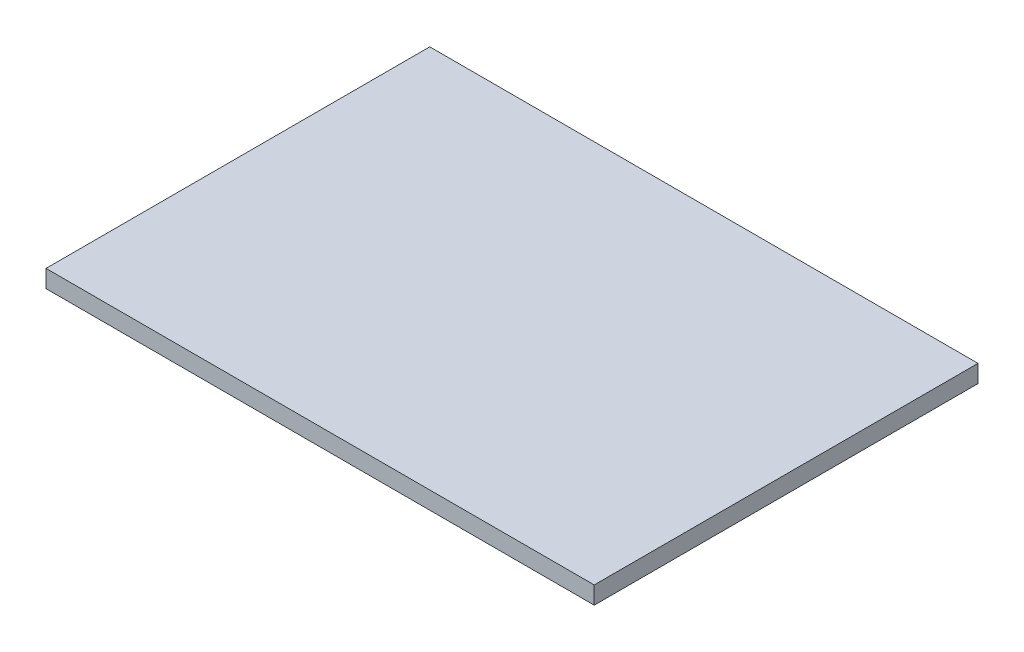
ISO-10303-21;
HEADER;
FILE_DESCRIPTION(('STEP AP214'),'2;1');
FILE_NAME('part.step','',(''),(''),'','','');
FILE_SCHEMA(('AUTOMOTIVE_DESIGN { 1 0 10303 214 1 1 1 1 }'));
ENDSEC;
DATA;
#1=APPLICATION_CONTEXT('core data for automotive mechanical design processes');
#2=APPLICATION_PROTOCOL_DEFINITION('international standard','automotive_design',2000,#1);
#3=PRODUCT_CONTEXT('',#1,'mechanical');
#4=PRODUCT('Part','Part','',(#3));
#5=PRODUCT_RELATED_PRODUCT_CATEGORY('part','',(#4));
#6=PRODUCT_DEFINITION_FORMATION('','',#4);
#7=PRODUCT_DEFINITION_CONTEXT('part definition',#1,'design');
#8=PRODUCT_DEFINITION('design','',#6,#7);
#9=PRODUCT_DEFINITION_SHAPE('','',#8);
#10=(LENGTH_UNIT() NAMED_UNIT(*) SI_UNIT(.MILLI.,.METRE.));
#11=(NAMED_UNIT(*) PLANE_ANGLE_UNIT() SI_UNIT($,.RADIAN.));
#12=(NAMED_UNIT(*) SI_UNIT($,.STERADIAN.) SOLID_ANGLE_UNIT());
#13=UNCERTAINTY_MEASURE_WITH_UNIT(LENGTH_MEASURE(1.E-05),#10,'distance_accuracy_value','');
#14=(GEOMETRIC_REPRESENTATION_CONTEXT(3) GLOBAL_UNCERTAINTY_ASSIGNED_CONTEXT((#13)) GLOBAL_UNIT_ASSIGNED_CONTEXT((#10,
#11,#12)) REPRESENTATION_CONTEXT('',''));
#15=CARTESIAN_POINT('',(0.,0.,0.));
#16=DIRECTION('',(0.,0.,1.));
#17=DIRECTION('',(1.,0.,0.));
#18=AXIS2_PLACEMENT_3D('',#15,#16,#17);
#19=CARTESIAN_POINT('',(-125.,8.,87.5));
#20=DIRECTION('',(1.,0.,0.));
#21=DIRECTION('',(0.,0.,-1.));
#22=AXIS2_PLACEMENT_3D('',#19,#20,#21);
#23=PLANE('',#22);
#24=DIRECTION('',(0.,0.,1.));
#25=VECTOR('',#24,1.);
#26=CARTESIAN_POINT('',(-125.,0.,87.5));
#27=LINE('',#26,#25);
#28=CARTESIAN_POINT('',(-125.,0.,-87.5));
#29=VERTEX_POINT('',#28);
#30=CARTESIAN_POINT('',(-125.,0.,87.5));
#31=VERTEX_POINT('',#30);
#32=EDGE_CURVE('E99',#29,#31,#27,.T.);
#33=ORIENTED_EDGE('',*,*,#32,.T.);
#34=DIRECTION('',(0.,-1.,0.));
#35=VECTOR('',#34,1.);
#36=CARTESIAN_POINT('',(-125.,8.,87.5));
#37=LINE('',#36,#35);
#38=CARTESIAN_POINT('',(-125.,8.,87.5));
#39=VERTEX_POINT('',#38);
#40=EDGE_CURVE('E11',#39,#31,#37,.T.);
#41=ORIENTED_EDGE('',*,*,#40,.F.);
#42=DIRECTION('',(0.,0.,1.));
#43=VECTOR('',#42,1.);
#44=CARTESIAN_POINT('',(-125.,8.,87.5));
#45=LINE('',#44,#43);
#46=CARTESIAN_POINT('',(-125.,8.,-87.5));
#47=VERTEX_POINT('',#46);
#48=EDGE_CURVE('E87',#47,#39,#45,.T.);
#49=ORIENTED_EDGE('',*,*,#48,.F.);
#50=DIRECTION('',(0.,-1.,0.));
#51=VECTOR('',#50,1.);
#52=CARTESIAN_POINT('',(-125.,8.,-87.5));
#53=LINE('',#52,#51);
#54=EDGE_CURVE('E95',#47,#29,#53,.T.);
#55=ORIENTED_EDGE('',*,*,#54,.T.);
#56=EDGE_LOOP('',(#33,#41,#49,#55));
#57=FACE_BOUND('',#56,.T.);
#58=ADVANCED_FACE('F36',(#57),#23,.F.);
#59=CARTESIAN_POINT('',(-125.,8.,87.5));
#60=DIRECTION('',(0.,0.,-1.));
#61=DIRECTION('',(-1.,0.,0.));
#62=AXIS2_PLACEMENT_3D('',#59,#60,#61);
#63=PLANE('',#62);
#64=DIRECTION('',(1.,0.,0.));
#65=VECTOR('',#64,1.);
#66=CARTESIAN_POINT('',(-125.,0.,87.5));
#67=LINE('',#66,#65);
#68=CARTESIAN_POINT('',(125.,0.,87.5));
#69=VERTEX_POINT('',#68);
#70=EDGE_CURVE('E91',#31,#69,#67,.T.);
#71=ORIENTED_EDGE('',*,*,#70,.T.);
#72=DIRECTION('',(0.,-1.,0.));
#73=VECTOR('',#72,1.);
#74=CARTESIAN_POINT('',(125.,8.,87.5));
#75=LINE('',#74,#73);
#76=CARTESIAN_POINT('',(125.,8.,87.5));
#77=VERTEX_POINT('',#76);
#78=EDGE_CURVE('E44',#77,#69,#75,.T.);
#79=ORIENTED_EDGE('',*,*,#78,.F.);
#80=DIRECTION('',(1.,0.,0.));
#81=VECTOR('',#80,1.);
#82=CARTESIAN_POINT('',(-125.,8.,87.5));
#83=LINE('',#82,#81);
#84=EDGE_CURVE('E82',#39,#77,#83,.T.);
#85=ORIENTED_EDGE('',*,*,#84,.F.);
#86=ORIENTED_EDGE('',*,*,#40,.T.);
#87=EDGE_LOOP('',(#71,#79,#85,#86));
#88=FACE_BOUND('',#87,.T.);
#89=ADVANCED_FACE('F90',(#88),#63,.F.);
#90=CARTESIAN_POINT('',(125.,8.,87.5));
#91=DIRECTION('',(-1.,0.,0.));
#92=DIRECTION('',(0.,0.,1.));
#93=AXIS2_PLACEMENT_3D('',#90,#91,#92);
#94=PLANE('',#93);
#95=DIRECTION('',(0.,0.,-1.));
#96=VECTOR('',#95,1.);
#97=CARTESIAN_POINT('',(125.,0.,87.5));
#98=LINE('',#97,#96);
#99=CARTESIAN_POINT('',(125.,0.,-87.5));
#100=VERTEX_POINT('',#99);
#101=EDGE_CURVE('E69',#69,#100,#98,.T.);
#102=ORIENTED_EDGE('',*,*,#101,.T.);
#103=DIRECTION('',(0.,-1.,0.));
#104=VECTOR('',#103,1.);
#105=CARTESIAN_POINT('',(125.,8.,-87.5));
#106=LINE('',#105,#104);
#107=CARTESIAN_POINT('',(125.,8.,-87.5));
#108=VERTEX_POINT('',#107);
#109=EDGE_CURVE('E92',#108,#100,#106,.T.);
#110=ORIENTED_EDGE('',*,*,#109,.F.);
#111=DIRECTION('',(0.,0.,-1.));
#112=VECTOR('',#111,1.);
#113=CARTESIAN_POINT('',(125.,8.,87.5));
#114=LINE('',#113,#112);
#115=EDGE_CURVE('E85',#77,#108,#114,.T.);
#116=ORIENTED_EDGE('',*,*,#115,.F.);
#117=ORIENTED_EDGE('',*,*,#78,.T.);
#118=EDGE_LOOP('',(#102,#110,#116,#117));
#119=FACE_BOUND('',#118,.T.);
#120=ADVANCED_FACE('F93',(#119),#94,.F.);
#121=CARTESIAN_POINT('',(-125.,8.,-87.5));
#122=DIRECTION('',(0.,0.,1.));
#123=DIRECTION('',(1.,0.,0.));
#124=AXIS2_PLACEMENT_3D('',#121,#122,#123);
#125=PLANE('',#124);
#126=DIRECTION('',(-1.,0.,0.));
#127=VECTOR('',#126,1.);
#128=CARTESIAN_POINT('',(-125.,0.,-87.5));
#129=LINE('',#128,#127);
#130=EDGE_CURVE('E75',#100,#29,#129,.T.);
#131=ORIENTED_EDGE('',*,*,#130,.T.);
#132=ORIENTED_EDGE('',*,*,#54,.F.);
#133=DIRECTION('',(-1.,0.,0.));
#134=VECTOR('',#133,1.);
#135=CARTESIAN_POINT('',(-125.,8.,-87.5));
#136=LINE('',#135,#134);
#137=EDGE_CURVE('E52',#108,#47,#136,.T.);
#138=ORIENTED_EDGE('',*,*,#137,.F.);
#139=ORIENTED_EDGE('',*,*,#109,.T.);
#140=EDGE_LOOP('',(#131,#132,#138,#139));
#141=FACE_BOUND('',#140,.T.);
#142=ADVANCED_FACE('F106',(#141),#125,.F.);
#143=CARTESIAN_POINT('',(0.,8.,0.));
#144=DIRECTION('',(0.,-1.,0.));
#145=DIRECTION('',(0.,0.,-1.));
#146=AXIS2_PLACEMENT_3D('',#143,#144,#145);
#147=PLANE('',#146);
#148=ORIENTED_EDGE('',*,*,#48,.T.);
#149=ORIENTED_EDGE('',*,*,#84,.T.);
#150=ORIENTED_EDGE('',*,*,#115,.T.);
#151=ORIENTED_EDGE('',*,*,#137,.T.);
#152=EDGE_LOOP('',(#148,#149,#150,#151));
#153=FACE_BOUND('',#152,.T.);
#154=ADVANCED_FACE('F83',(#153),#147,.F.);
#155=CARTESIAN_POINT('',(0.,0.,0.));
#156=DIRECTION('',(0.,-1.,0.));
#157=DIRECTION('',(0.,0.,-1.));
#158=AXIS2_PLACEMENT_3D('',#155,#156,#157);
#159=PLANE('',#158);
#160=ORIENTED_EDGE('',*,*,#32,.F.);
#161=ORIENTED_EDGE('',*,*,#130,.F.);
#162=ORIENTED_EDGE('',*,*,#101,.F.);
#163=ORIENTED_EDGE('',*,*,#70,.F.);
#164=EDGE_LOOP('',(#160,#161,#162,#163));
#165=FACE_BOUND('',#164,.T.);
#166=ADVANCED_FACE('F109',(#165),#159,.T.);
#167=CLOSED_SHELL('',(#58,#89,#120,#142,#154,#166));
#168=MANIFOLD_SOLID_BREP('B2',#167);
#169=ADVANCED_BREP_SHAPE_REPRESENTATION('',(#18,#168),#14);
#170=SHAPE_DEFINITION_REPRESENTATION(#9,#169);
ENDSEC;
END-ISO-10303-21;
